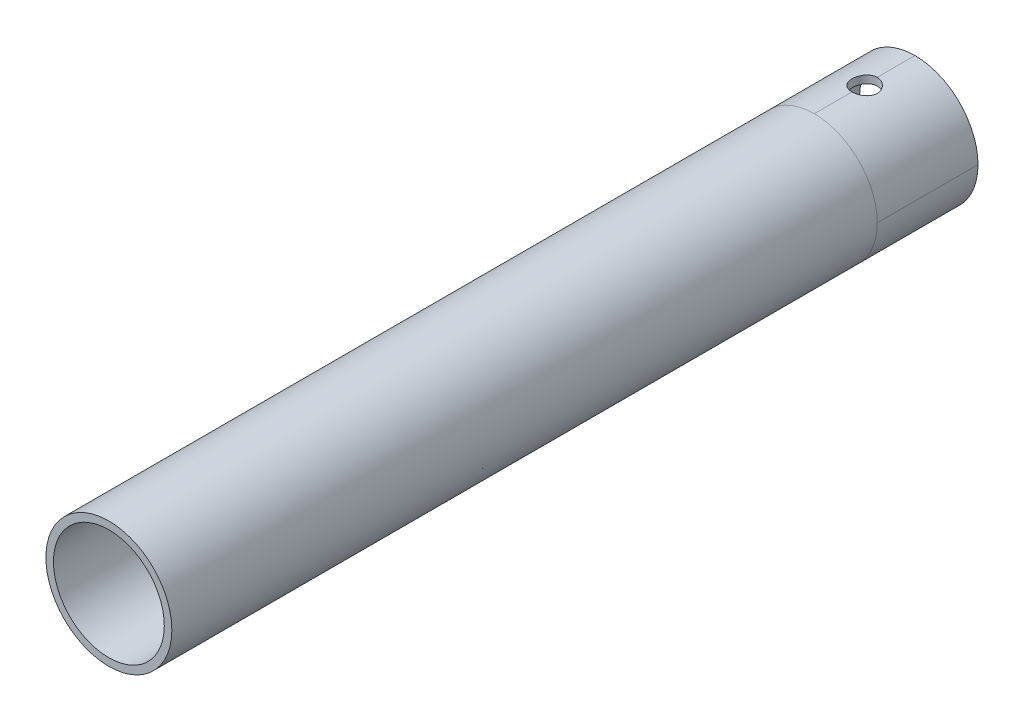
ISO-10303-21;
HEADER;
FILE_DESCRIPTION(('STEP AP214'),'2;1');
FILE_NAME('part.step','',(''),(''),'','','');
FILE_SCHEMA(('AUTOMOTIVE_DESIGN { 1 0 10303 214 1 1 1 1 }'));
ENDSEC;
DATA;
#1=APPLICATION_CONTEXT('core data for automotive mechanical design processes');
#2=APPLICATION_PROTOCOL_DEFINITION('international standard','automotive_design',2000,#1);
#3=PRODUCT_CONTEXT('',#1,'mechanical');
#4=PRODUCT('Part','Part','',(#3));
#5=PRODUCT_RELATED_PRODUCT_CATEGORY('part','',(#4));
#6=PRODUCT_DEFINITION_FORMATION('','',#4);
#7=PRODUCT_DEFINITION_CONTEXT('part definition',#1,'design');
#8=PRODUCT_DEFINITION('design','',#6,#7);
#9=PRODUCT_DEFINITION_SHAPE('','',#8);
#10=(LENGTH_UNIT() NAMED_UNIT(*) SI_UNIT(.MILLI.,.METRE.));
#11=(NAMED_UNIT(*) PLANE_ANGLE_UNIT() SI_UNIT($,.RADIAN.));
#12=(NAMED_UNIT(*) SI_UNIT($,.STERADIAN.) SOLID_ANGLE_UNIT());
#13=UNCERTAINTY_MEASURE_WITH_UNIT(LENGTH_MEASURE(1.E-05),#10,'distance_accuracy_value','');
#14=(GEOMETRIC_REPRESENTATION_CONTEXT(3) GLOBAL_UNCERTAINTY_ASSIGNED_CONTEXT((#13)) GLOBAL_UNIT_ASSIGNED_CONTEXT((#10,
#11,#12)) REPRESENTATION_CONTEXT('',''));
#15=CARTESIAN_POINT('',(0.,0.,0.));
#16=DIRECTION('',(0.,0.,1.));
#17=DIRECTION('',(1.,0.,0.));
#18=AXIS2_PLACEMENT_3D('',#15,#16,#17);
#19=CARTESIAN_POINT('',(0.,0.,140.));
#20=DIRECTION('',(0.,0.,1.));
#21=DIRECTION('',(1.,0.,0.));
#22=AXIS2_PLACEMENT_3D('',#19,#20,#21);
#23=PLANE('',#22);
#24=CARTESIAN_POINT('',(0.,0.,140.));
#25=DIRECTION('',(0.,0.,1.));
#26=DIRECTION('',(1.,0.,0.));
#27=AXIS2_PLACEMENT_3D('',#24,#25,#26);
#28=CIRCLE('',#27,12.5);
#29=CARTESIAN_POINT('',(12.5,0.,140.));
#30=VERTEX_POINT('',#29);
#31=EDGE_CURVE('E118',#30,#30,#28,.T.);
#32=ORIENTED_EDGE('',*,*,#31,.T.);
#33=EDGE_LOOP('',(#32));
#34=FACE_BOUND('',#33,.T.);
#35=CARTESIAN_POINT('',(0.,0.,140.));
#36=DIRECTION('',(0.,0.,1.));
#37=DIRECTION('',(1.,0.,0.));
#38=AXIS2_PLACEMENT_3D('',#35,#36,#37);
#39=CIRCLE('',#38,11.);
#40=CARTESIAN_POINT('',(11.,0.,140.));
#41=VERTEX_POINT('',#40);
#42=EDGE_CURVE('E115',#41,#41,#39,.T.);
#43=ORIENTED_EDGE('',*,*,#42,.F.);
#44=EDGE_LOOP('',(#43));
#45=FACE_BOUND('',#44,.T.);
#46=ADVANCED_FACE('F35',(#34,#45),#23,.T.);
#47=CARTESIAN_POINT('',(0.,0.,140.));
#48=DIRECTION('',(0.,0.,-1.));
#49=DIRECTION('',(-1.,0.,0.));
#50=AXIS2_PLACEMENT_3D('',#47,#48,#49);
#51=CYLINDRICAL_SURFACE('',#50,12.5);
#52=ORIENTED_EDGE('',*,*,#31,.F.);
#53=EDGE_LOOP('',(#52));
#54=FACE_BOUND('',#53,.T.);
#55=CARTESIAN_POINT('',(0.,0.,0.));
#56=DIRECTION('',(0.,0.,1.));
#57=DIRECTION('',(1.,0.,0.));
#58=AXIS2_PLACEMENT_3D('',#55,#56,#57);
#59=CIRCLE('',#58,12.5);
#60=CARTESIAN_POINT('',(12.5,0.,0.));
#61=VERTEX_POINT('',#60);
#62=CARTESIAN_POINT('',(0.,12.5,0.));
#63=VERTEX_POINT('',#62);
#64=EDGE_CURVE('E98',#61,#63,#59,.T.);
#65=ORIENTED_EDGE('',*,*,#64,.T.);
#66=CARTESIAN_POINT('',(-12.5,0.,0.));
#67=VERTEX_POINT('',#66);
#68=EDGE_CURVE('E90',#63,#67,#59,.T.);
#69=ORIENTED_EDGE('',*,*,#68,.T.);
#70=CARTESIAN_POINT('',(0.,-12.5,0.));
#71=VERTEX_POINT('',#70);
#72=EDGE_CURVE('E95',#67,#71,#59,.T.);
#73=ORIENTED_EDGE('',*,*,#72,.T.);
#74=EDGE_CURVE('E114',#71,#61,#59,.T.);
#75=ORIENTED_EDGE('',*,*,#74,.T.);
#76=EDGE_LOOP('',(#65,#69,#73,#75));
#77=FACE_BOUND('',#76,.T.);
#78=ADVANCED_FACE('F92',(#54,#77),#51,.T.);
#79=CARTESIAN_POINT('',(0.,0.,140.));
#80=DIRECTION('',(0.,0.,-1.));
#81=DIRECTION('',(-1.,0.,0.));
#82=AXIS2_PLACEMENT_3D('',#79,#80,#81);
#83=CYLINDRICAL_SURFACE('',#82,11.);
#84=CARTESIAN_POINT('',(0.,11.,-12.5));
#85=CARTESIAN_POINT('',(0.138518278596903,10.9999974735185,-12.4999954681736));
#86=CARTESIAN_POINT('',(0.277090172258006,10.9973570934613,-12.4884487724231));
#87=CARTESIAN_POINT('',(0.550288594599322,10.987079320306,-12.4426205239383));
#88=CARTESIAN_POINT('',(0.684912392220729,10.9794385496265,-12.4083236040447));
#89=CARTESIAN_POINT('',(0.946227671984914,10.9600095312294,-12.3181319513681));
#90=CARTESIAN_POINT('',(1.07292759495647,10.9482257885674,-12.2622606720193));
#91=CARTESIAN_POINT('',(1.31515227582566,10.921778201627,-12.1305828866191));
#92=CARTESIAN_POINT('',(1.43067714503182,10.9071143860398,-12.0547765791576));
#93=CARTESIAN_POINT('',(1.64926760444638,10.8762265816814,-11.8839979553933));
#94=CARTESIAN_POINT('',(1.75211293892049,10.8599819758326,-11.788747426525));
#95=CARTESIAN_POINT('',(1.9405138981661,10.827906511833,-11.5823810258628));
#96=CARTESIAN_POINT('',(2.02606788121784,10.8120756930933,-11.4712636493056));
#97=CARTESIAN_POINT('',(2.17844599401787,10.7824158369221,-11.2346679447163));
#98=CARTESIAN_POINT('',(2.24503254356575,10.7686131580577,-11.1090330036942));
#99=CARTESIAN_POINT('',(2.35606069717869,10.7448696147509,-10.8479904994184));
#100=CARTESIAN_POINT('',(2.40050517717749,10.7349282488168,-10.7125842079384));
#101=CARTESIAN_POINT('',(2.46525349412718,10.7202434469831,-10.4382408128835));
#102=CARTESIAN_POINT('',(2.48594892680754,10.715415797339,-10.2994007368775));
#103=CARTESIAN_POINT('',(2.50382988451487,10.7112523406768,-10.0201417727869));
#104=CARTESIAN_POINT('',(2.50101853886552,10.711915802658,-9.87972309733773));
#105=CARTESIAN_POINT('',(2.47228016958762,10.7185835035919,-9.60422711665131));
#106=CARTESIAN_POINT('',(2.44681104599437,10.7244819412976,-9.46909909380509));
#107=CARTESIAN_POINT('',(2.37420684920502,10.7407873672743,-9.20508551384518));
#108=CARTESIAN_POINT('',(2.32707047404288,10.7511946264744,-9.07620033237282));
#109=CARTESIAN_POINT('',(2.21205734402544,10.7754474384537,-8.82705932818947));
#110=CARTESIAN_POINT('',(2.14400712086008,10.7893215597825,-8.70688648223632));
#111=CARTESIAN_POINT('',(1.98921977920408,10.8189276843241,-8.47949744688894));
#112=CARTESIAN_POINT('',(1.90247992237134,10.8346599596346,-8.37228315973607));
#113=CARTESIAN_POINT('',(1.71036518003516,10.8666615287251,-8.17122143817898));
#114=CARTESIAN_POINT('',(1.60460166742827,10.882934773515,-8.07774557348365));
#115=CARTESIAN_POINT('',(1.37871229840972,10.9138502597158,-7.90979411129289));
#116=CARTESIAN_POINT('',(1.2585861400908,10.9284924668293,-7.83531891330053));
#117=CARTESIAN_POINT('',(1.00690799179915,10.9545497424637,-7.7073796120285));
#118=CARTESIAN_POINT('',(0.875328834348158,10.9659568484873,-7.65396722637767));
#119=CARTESIAN_POINT('',(0.604745122491698,10.9841998956698,-7.57011599413208));
#120=CARTESIAN_POINT('',(0.465741739663721,10.9910365557784,-7.53967353417782));
#121=CARTESIAN_POINT('',(0.187439840192733,10.9992650071756,-7.50317376252731));
#122=CARTESIAN_POINT('',(0.0482110923370386,11.0007700184113,-7.49660930868327));
#123=CARTESIAN_POINT('',(-0.229353886680103,10.9984842255063,-7.50667303985293));
#124=CARTESIAN_POINT('',(-0.367690182720858,10.9946938107912,-7.52329951940597));
#125=CARTESIAN_POINT('',(-0.637841677218459,10.9823148103741,-7.57885316690542));
#126=CARTESIAN_POINT('',(-0.769715036814426,10.973784087055,-7.61751154644373));
#127=CARTESIAN_POINT('',(-1.0251039308776,10.9528806132367,-7.71573102745708));
#128=CARTESIAN_POINT('',(-1.14861871432289,10.9405075180554,-7.77529400425327));
#129=CARTESIAN_POINT('',(-1.38586085256056,10.9130143275095,-7.91466914355534));
#130=CARTESIAN_POINT('',(-1.49941068522719,10.8978552985532,-7.99477562677316));
#131=CARTESIAN_POINT('',(-1.71163773579052,10.866546095646,-8.17257932844021));
#132=CARTESIAN_POINT('',(-1.8103128535797,10.8503957821912,-8.27027902654685));
#133=CARTESIAN_POINT('',(-1.99201706218096,10.8185287714487,-8.48283096513342));
#134=CARTESIAN_POINT('',(-2.07469366594062,10.8028272119253,-8.59798724178681));
#135=CARTESIAN_POINT('',(-2.21953814406553,10.7740023321604,-8.84084639067028));
#136=CARTESIAN_POINT('',(-2.28170692501017,10.7608788979592,-8.96854870795962));
#137=CARTESIAN_POINT('',(-2.38333597241928,10.7388274870674,-9.23218046956891));
#138=CARTESIAN_POINT('',(-2.42292716221705,10.7298753781702,-9.36805732374335));
#139=CARTESIAN_POINT('',(-2.47865258340365,10.7171411058581,-9.64476690669913));
#140=CARTESIAN_POINT('',(-2.49479091341614,10.7133580391079,-9.7855987651364));
#141=CARTESIAN_POINT('',(-2.50296739214165,10.7114502943222,-10.0646586193109));
#142=CARTESIAN_POINT('',(-2.49556548501071,10.7131941458177,-10.2028695993336));
#143=CARTESIAN_POINT('',(-2.45813115403283,10.7218446846914,-10.4760189101883));
#144=CARTESIAN_POINT('',(-2.42809904217009,10.7287513008948,-10.6109572861105));
#145=CARTESIAN_POINT('',(-2.34653692360609,10.7468826027048,-10.8732433973663));
#146=CARTESIAN_POINT('',(-2.29509457527995,10.758089666867,-11.0006196911415));
#147=CARTESIAN_POINT('',(-2.1722453660688,10.783564723281,-11.2450147069006));
#148=CARTESIAN_POINT('',(-2.10083623731223,10.7978330631966,-11.3620322503255));
#149=CARTESIAN_POINT('',(-1.93824996891049,10.828211072634,-11.5851344276553));
#150=CARTESIAN_POINT('',(-1.84667645642834,10.8443540558786,-11.6909257222074));
#151=CARTESIAN_POINT('',(-1.64715628932418,10.8764454859305,-11.885823185082));
#152=CARTESIAN_POINT('',(-1.53920583540676,10.8923938866665,-11.974925470966));
#153=CARTESIAN_POINT('',(-1.30814060515057,10.9225693389041,-12.1351380602337));
#154=CARTESIAN_POINT('',(-1.1848316218762,10.9367686161711,-12.2059738233331));
#155=CARTESIAN_POINT('',(-0.927755967711692,10.9615640551399,-12.325799970663));
#156=CARTESIAN_POINT('',(-0.793997844337698,10.9721631246672,-12.3748079947867));
#157=CARTESIAN_POINT('',(-0.550163071539624,10.9867559512784,-12.4412279061761));
#158=CARTESIAN_POINT('',(-0.441368111138491,10.9916908558499,-12.4632239876893));
#159=CARTESIAN_POINT('',(-0.221726814930918,10.9983138080738,-12.4926114735793));
#160=CARTESIAN_POINT('',(-0.110880584717102,11.0000020223883,-12.5000036276192));
#161=CARTESIAN_POINT('',(0.,11.,-12.5));
#162=B_SPLINE_CURVE_WITH_KNOTS('',3,(#84,#85,#86,#87,#88,#89,#90,#91,#92,#93,#94,#95,#96,#97,
#98,#99,#100,#101,#102,#103,#104,#105,#106,#107,#108,#109,#110,#111,#112,#113,#114,#115,#116,
#117,#118,#119,#120,#121,#122,#123,#124,#125,#126,#127,#128,#129,#130,#131,#132,#133,#134,#135,
#136,#137,#138,#139,#140,#141,#142,#143,#144,#145,#146,#147,#148,#149,#150,#151,#152,#153,#154,
#155,#156,#157,#158,#159,#160,#161),.UNSPECIFIED.,.T.,.F.,(4,2,2,2,2,2,2,2,2,2,2,2,2,2,2,2,2,2,
2,2,2,2,2,2,2,2,2,2,2,2,2,2,2,2,2,2,2,2,4),(0.,0.415148849633315,0.830578406996928,
1.24555761755318,1.66053269430525,2.08192389396809,2.50335508365802,2.92985362973414,
3.35629676538239,3.77560244898081,4.19485231368757,4.60581714174235,5.01680666753971,
5.4313015743885,5.84585725297978,6.27011531803704,6.69438230269862,7.11968464096647,
7.54492006169895,7.96106941916761,8.37718817463627,8.78833576149036,9.19952024123083,
9.61696129328767,10.0344612272567,10.4603132154039,10.8861463755948,11.3094844190899,
11.732748471094,12.1460204395145,12.5592867105953,12.9708773657615,13.382514789318,
13.8031102578591,14.2238034502007,14.6504927745347,15.0768366452215,15.4091704772436,
15.74148724914),.UNSPECIFIED.);
#163=CARTESIAN_POINT('',(0.,11.,-12.5));
#164=VERTEX_POINT('',#163);
#165=EDGE_CURVE('E151',#164,#164,#162,.T.);
#166=ORIENTED_EDGE('',*,*,#165,.F.);
#167=EDGE_LOOP('',(#166));
#168=FACE_BOUND('',#167,.T.);
#169=CARTESIAN_POINT('',(0.,-11.,-12.5));
#170=CARTESIAN_POINT('',(-0.138518278596905,-10.9999974735185,-12.4999954681736));
#171=CARTESIAN_POINT('',(-0.277090172258009,-10.9973570934613,-12.4884487724231));
#172=CARTESIAN_POINT('',(-0.550288594599324,-10.987079320306,-12.4426205239383));
#173=CARTESIAN_POINT('',(-0.684912392220731,-10.9794385496265,-12.4083236040447));
#174=CARTESIAN_POINT('',(-0.946227671984917,-10.9600095312294,-12.3181319513681));
#175=CARTESIAN_POINT('',(-1.07292759495647,-10.9482257885674,-12.2622606720193));
#176=CARTESIAN_POINT('',(-1.31515227582566,-10.921778201627,-12.1305828866191));
#177=CARTESIAN_POINT('',(-1.43067714503182,-10.9071143860398,-12.0547765791576));
#178=CARTESIAN_POINT('',(-1.64926760444638,-10.8762265816814,-11.8839979553933));
#179=CARTESIAN_POINT('',(-1.75211293892049,-10.8599819758326,-11.788747426525));
#180=CARTESIAN_POINT('',(-1.94051389816611,-10.827906511833,-11.5823810258628));
#181=CARTESIAN_POINT('',(-2.02606788121784,-10.8120756930933,-11.4712636493056));
#182=CARTESIAN_POINT('',(-2.17844599401787,-10.7824158369221,-11.2346679447163));
#183=CARTESIAN_POINT('',(-2.24503254356575,-10.7686131580577,-11.1090330036942));
#184=CARTESIAN_POINT('',(-2.3560606971787,-10.7448696147509,-10.8479904994184));
#185=CARTESIAN_POINT('',(-2.40050517717749,-10.7349282488168,-10.7125842079384));
#186=CARTESIAN_POINT('',(-2.46525349412718,-10.7202434469831,-10.4382408128835));
#187=CARTESIAN_POINT('',(-2.48594892680754,-10.715415797339,-10.2994007368775));
#188=CARTESIAN_POINT('',(-2.50382988451487,-10.7112523406768,-10.0201417727869));
#189=CARTESIAN_POINT('',(-2.50101853886553,-10.711915802658,-9.87972309733773));
#190=CARTESIAN_POINT('',(-2.47228016958762,-10.7185835035919,-9.60422711665131));
#191=CARTESIAN_POINT('',(-2.44681104599438,-10.7244819412976,-9.46909909380509));
#192=CARTESIAN_POINT('',(-2.37420684920502,-10.7407873672743,-9.20508551384518));
#193=CARTESIAN_POINT('',(-2.32707047404288,-10.7511946264744,-9.07620033237282));
#194=CARTESIAN_POINT('',(-2.21205734402544,-10.7754474384537,-8.82705932818947));
#195=CARTESIAN_POINT('',(-2.14400712086008,-10.7893215597825,-8.70688648223631));
#196=CARTESIAN_POINT('',(-1.98921977920408,-10.8189276843241,-8.47949744688894));
#197=CARTESIAN_POINT('',(-1.90247992237134,-10.8346599596346,-8.37228315973607));
#198=CARTESIAN_POINT('',(-1.71036518003516,-10.8666615287251,-8.17122143817898));
#199=CARTESIAN_POINT('',(-1.60460166742827,-10.882934773515,-8.07774557348365));
#200=CARTESIAN_POINT('',(-1.37871229840972,-10.9138502597158,-7.90979411129289));
#201=CARTESIAN_POINT('',(-1.2585861400908,-10.9284924668293,-7.83531891330053));
#202=CARTESIAN_POINT('',(-1.00690799179916,-10.9545497424637,-7.7073796120285));
#203=CARTESIAN_POINT('',(-0.875328834348159,-10.9659568484873,-7.65396722637767));
#204=CARTESIAN_POINT('',(-0.604745122491699,-10.9841998956698,-7.57011599413208));
#205=CARTESIAN_POINT('',(-0.465741739663722,-10.9910365557784,-7.53967353417782));
#206=CARTESIAN_POINT('',(-0.187439840192734,-10.9992650071756,-7.50317376252731));
#207=CARTESIAN_POINT('',(-0.0482110923370392,-11.0007700184113,-7.49660930868327));
#208=CARTESIAN_POINT('',(0.229353886680103,-10.9984842255063,-7.50667303985293));
#209=CARTESIAN_POINT('',(0.367690182720857,-10.9946938107912,-7.52329951940597));
#210=CARTESIAN_POINT('',(0.637841677218458,-10.9823148103741,-7.57885316690542));
#211=CARTESIAN_POINT('',(0.769715036814426,-10.973784087055,-7.61751154644374));
#212=CARTESIAN_POINT('',(1.0251039308776,-10.9528806132367,-7.71573102745708));
#213=CARTESIAN_POINT('',(1.14861871432289,-10.9405075180554,-7.77529400425327));
#214=CARTESIAN_POINT('',(1.38586085256056,-10.9130143275095,-7.91466914355534));
#215=CARTESIAN_POINT('',(1.49941068522719,-10.8978552985532,-7.99477562677316));
#216=CARTESIAN_POINT('',(1.71163773579052,-10.866546095646,-8.17257932844021));
#217=CARTESIAN_POINT('',(1.8103128535797,-10.8503957821912,-8.27027902654685));
#218=CARTESIAN_POINT('',(1.99201706218096,-10.8185287714487,-8.48283096513343));
#219=CARTESIAN_POINT('',(2.07469366594062,-10.8028272119253,-8.59798724178681));
#220=CARTESIAN_POINT('',(2.21953814406552,-10.7740023321604,-8.84084639067028));
#221=CARTESIAN_POINT('',(2.28170692501017,-10.7608788979592,-8.96854870795963));
#222=CARTESIAN_POINT('',(2.38333597241927,-10.7388274870674,-9.23218046956892));
#223=CARTESIAN_POINT('',(2.42292716221704,-10.7298753781702,-9.36805732374335));
#224=CARTESIAN_POINT('',(2.47865258340364,-10.7171411058581,-9.64476690669913));
#225=CARTESIAN_POINT('',(2.49479091341614,-10.7133580391079,-9.7855987651364));
#226=CARTESIAN_POINT('',(2.50296739214164,-10.7114502943222,-10.0646586193109));
#227=CARTESIAN_POINT('',(2.4955654850107,-10.7131941458177,-10.2028695993336));
#228=CARTESIAN_POINT('',(2.45813115403283,-10.7218446846914,-10.4760189101883));
#229=CARTESIAN_POINT('',(2.42809904217009,-10.7287513008948,-10.6109572861105));
#230=CARTESIAN_POINT('',(2.34653692360609,-10.7468826027048,-10.8732433973663));
#231=CARTESIAN_POINT('',(2.29509457527995,-10.758089666867,-11.0006196911415));
#232=CARTESIAN_POINT('',(2.1722453660688,-10.783564723281,-11.2450147069006));
#233=CARTESIAN_POINT('',(2.10083623731223,-10.7978330631966,-11.3620322503255));
#234=CARTESIAN_POINT('',(1.93824996891049,-10.828211072634,-11.5851344276553));
#235=CARTESIAN_POINT('',(1.84667645642834,-10.8443540558786,-11.6909257222074));
#236=CARTESIAN_POINT('',(1.64715628932417,-10.8764454859305,-11.885823185082));
#237=CARTESIAN_POINT('',(1.53920583540675,-10.8923938866665,-11.974925470966));
#238=CARTESIAN_POINT('',(1.30814060515056,-10.9225693389041,-12.1351380602337));
#239=CARTESIAN_POINT('',(1.18483162187619,-10.9367686161711,-12.2059738233331));
#240=CARTESIAN_POINT('',(0.927755967711685,-10.9615640551399,-12.325799970663));
#241=CARTESIAN_POINT('',(0.793997844337692,-10.9721631246672,-12.3748079947867));
#242=CARTESIAN_POINT('',(0.550163071539618,-10.9867559512784,-12.4412279061761));
#243=CARTESIAN_POINT('',(0.441368111138485,-10.9916908558499,-12.4632239876893));
#244=CARTESIAN_POINT('',(0.221726814930914,-10.9983138080738,-12.4926114735793));
#245=CARTESIAN_POINT('',(0.110880584717099,-11.0000020223883,-12.5000036276192));
#246=CARTESIAN_POINT('',(0.,-11.,-12.5));
#247=B_SPLINE_CURVE_WITH_KNOTS('',3,(#169,#170,#171,#172,#173,#174,#175,#176,#177,#178,#179,
#180,#181,#182,#183,#184,#185,#186,#187,#188,#189,#190,#191,#192,#193,#194,#195,#196,#197,#198,
#199,#200,#201,#202,#203,#204,#205,#206,#207,#208,#209,#210,#211,#212,#213,#214,#215,#216,#217,
#218,#219,#220,#221,#222,#223,#224,#225,#226,#227,#228,#229,#230,#231,#232,#233,#234,#235,#236,
#237,#238,#239,#240,#241,#242,#243,#244,#245,#246),.UNSPECIFIED.,.T.,.F.,(4,2,2,2,2,2,2,2,2,2,2,
2,2,2,2,2,2,2,2,2,2,2,2,2,2,2,2,2,2,2,2,2,2,2,2,2,2,2,4),(0.,0.415148849633315,
0.830578406996929,1.24555761755319,1.66053269430525,2.08192389396809,2.50335508365802,
2.92985362973414,3.35629676538239,3.77560244898082,4.19485231368758,4.60581714174235,
5.01680666753971,5.4313015743885,5.84585725297978,6.27011531803704,6.69438230269863,
7.11968464096647,7.54492006169895,7.96106941916762,8.37718817463627,8.78833576149036,
9.19952024123083,9.61696129328767,10.0344612272567,10.460313215404,10.8861463755948,
11.3094844190899,11.732748471094,12.1460204395145,12.5592867105953,12.9708773657615,
13.382514789318,13.8031102578591,14.2238034502007,14.6504927745347,15.0768366452215,
15.4091704772436,15.74148724914),.UNSPECIFIED.);
#248=CARTESIAN_POINT('',(0.,-11.,-12.5));
#249=VERTEX_POINT('',#248);
#250=EDGE_CURVE('E145',#249,#249,#247,.T.);
#251=ORIENTED_EDGE('',*,*,#250,.F.);
#252=EDGE_LOOP('',(#251));
#253=FACE_BOUND('',#252,.T.);
#254=ORIENTED_EDGE('',*,*,#42,.T.);
#255=EDGE_LOOP('',(#254));
#256=FACE_BOUND('',#255,.T.);
#257=CARTESIAN_POINT('',(0.,0.,-20.));
#258=DIRECTION('',(0.,0.,-1.));
#259=DIRECTION('',(-1.,0.,0.));
#260=AXIS2_PLACEMENT_3D('',#257,#258,#259);
#261=CIRCLE('',#260,11.);
#262=CARTESIAN_POINT('',(-11.,0.,-20.));
#263=VERTEX_POINT('',#262);
#264=EDGE_CURVE('E209',#263,#263,#261,.F.);
#265=ORIENTED_EDGE('',*,*,#264,.F.);
#266=EDGE_LOOP('',(#265));
#267=FACE_BOUND('',#266,.T.);
#268=ADVANCED_FACE('F182',(#168,#253,#256,#267),#83,.F.);
#269=CARTESIAN_POINT('',(0.,0.,-20.));
#270=DIRECTION('',(0.,0.,-1.));
#271=DIRECTION('',(-1.,0.,0.));
#272=AXIS2_PLACEMENT_3D('',#269,#270,#271);
#273=PLANE('',#272);
#274=CARTESIAN_POINT('',(0.,0.,-20.));
#275=DIRECTION('',(0.,0.,-1.));
#276=DIRECTION('',(-1.,0.,0.));
#277=AXIS2_PLACEMENT_3D('',#274,#275,#276);
#278=CIRCLE('',#277,12.5);
#279=CARTESIAN_POINT('',(0.,12.5,-20.));
#280=VERTEX_POINT('',#279);
#281=CARTESIAN_POINT('',(12.5,0.,-20.));
#282=VERTEX_POINT('',#281);
#283=EDGE_CURVE('E200',#280,#282,#278,.T.);
#284=ORIENTED_EDGE('',*,*,#283,.T.);
#285=CARTESIAN_POINT('',(0.,0.,-20.));
#286=DIRECTION('',(0.,0.,-1.));
#287=DIRECTION('',(-1.,0.,0.));
#288=AXIS2_PLACEMENT_3D('',#285,#286,#287);
#289=CIRCLE('',#288,12.5);
#290=CARTESIAN_POINT('',(0.,-12.5,-20.));
#291=VERTEX_POINT('',#290);
#292=EDGE_CURVE('E161',#282,#291,#289,.T.);
#293=ORIENTED_EDGE('',*,*,#292,.T.);
#294=CARTESIAN_POINT('',(0.,0.,-20.));
#295=DIRECTION('',(0.,0.,-1.));
#296=DIRECTION('',(-1.,0.,0.));
#297=AXIS2_PLACEMENT_3D('',#294,#295,#296);
#298=CIRCLE('',#297,12.5);
#299=CARTESIAN_POINT('',(-12.5,0.,-20.));
#300=VERTEX_POINT('',#299);
#301=EDGE_CURVE('E201',#291,#300,#298,.T.);
#302=ORIENTED_EDGE('',*,*,#301,.T.);
#303=CARTESIAN_POINT('',(0.,0.,-20.));
#304=DIRECTION('',(0.,0.,-1.));
#305=DIRECTION('',(-1.,0.,0.));
#306=AXIS2_PLACEMENT_3D('',#303,#304,#305);
#307=CIRCLE('',#306,12.5);
#308=EDGE_CURVE('E105',#300,#280,#307,.T.);
#309=ORIENTED_EDGE('',*,*,#308,.T.);
#310=EDGE_LOOP('',(#284,#293,#302,#309));
#311=FACE_BOUND('',#310,.T.);
#312=ORIENTED_EDGE('',*,*,#264,.T.);
#313=EDGE_LOOP('',(#312));
#314=FACE_BOUND('',#313,.T.);
#315=ADVANCED_FACE('F139',(#311,#314),#273,.T.);
#316=CARTESIAN_POINT('',(0.,27.5,-10.));
#317=DIRECTION('',(0.,-1.,0.));
#318=DIRECTION('',(0.,0.,-1.));
#319=AXIS2_PLACEMENT_3D('',#316,#317,#318);
#320=CYLINDRICAL_SURFACE('',#319,2.5);
#321=ORIENTED_EDGE('',*,*,#250,.T.);
#322=EDGE_LOOP('',(#321));
#323=FACE_BOUND('',#322,.T.);
#324=CARTESIAN_POINT('',(0.,-12.5,-7.5));
#325=CARTESIAN_POINT('',(-0.0695781037013801,-12.5000055691702,-7.49999248083964));
#326=CARTESIAN_POINT('',(-0.139152113651009,-12.499419188421,-7.50290458457511));
#327=CARTESIAN_POINT('',(-0.277789170105315,-12.497103769276,-7.514509744488));
#328=CARTESIAN_POINT('',(-0.346852276173052,-12.4953748662721,-7.52320211568845));
#329=CARTESIAN_POINT('',(-0.483879393643665,-12.4908190204693,-7.5462923419301));
#330=CARTESIAN_POINT('',(-0.551844888273851,-12.4879937162335,-7.5606816835385));
#331=CARTESIAN_POINT('',(-0.686280644932569,-12.4813283643556,-7.5950386833208));
#332=CARTESIAN_POINT('',(-0.752750902776739,-12.4774883138739,-7.61500635710333));
#333=CARTESIAN_POINT('',(-0.949237994536963,-12.4645938225901,-7.68308015982211));
#334=CARTESIAN_POINT('',(-1.07643631854857,-12.4541613083796,-7.73937492926214));
#335=CARTESIAN_POINT('',(-1.31952361958077,-12.4307613572158,-7.87207451483428));
#336=CARTESIAN_POINT('',(-1.43541159011704,-12.417793694973,-7.94848111844315));
#337=CARTESIAN_POINT('',(-1.65422316246035,-12.3905548780014,-8.12034099913268));
#338=CARTESIAN_POINT('',(-1.75697429492782,-12.3762699355359,-8.21601206223506));
#339=CARTESIAN_POINT('',(-1.94508588038253,-12.3481056979896,-8.42322158753791));
#340=CARTESIAN_POINT('',(-2.03044344391941,-12.3342264706343,-8.53476268087781));
#341=CARTESIAN_POINT('',(-2.18208108228169,-12.3083106950016,-8.77179367925153));
#342=CARTESIAN_POINT('',(-2.24818089578944,-12.2962920225725,-8.89740104350523));
#343=CARTESIAN_POINT('',(-2.35826671661896,-12.2756562198657,-9.15821206194541));
#344=CARTESIAN_POINT('',(-2.40225612807952,-12.2670385660078,-9.29341423524573));
#345=CARTESIAN_POINT('',(-2.46631284614522,-12.2543202064808,-9.56770930120907));
#346=CARTESIAN_POINT('',(-2.48668576132239,-12.2501618495002,-9.70672809585308));
#347=CARTESIAN_POINT('',(-2.50388039948337,-12.2466593618523,-9.98627126048349));
#348=CARTESIAN_POINT('',(-2.50070398034014,-12.2473148514071,-10.1267955108268));
#349=CARTESIAN_POINT('',(-2.47113637976745,-12.2533137895302,-10.4031174731333));
#350=CARTESIAN_POINT('',(-2.44509616848213,-12.2585863604449,-10.5389545087181));
#351=CARTESIAN_POINT('',(-2.37109435205471,-12.2731137212811,-10.8042911390024));
#352=CARTESIAN_POINT('',(-2.32313185988532,-12.2823686723383,-10.9337904770287));
#353=CARTESIAN_POINT('',(-2.20631104875647,-12.3038906375592,-11.1837901788259));
#354=CARTESIAN_POINT('',(-2.13731328401866,-12.3161776447723,-11.3042235889813));
#355=CARTESIAN_POINT('',(-1.98048094880143,-12.342365918702,-11.5319306128859));
#356=CARTESIAN_POINT('',(-1.89264482136082,-12.356267318802,-11.6392031377559));
#357=CARTESIAN_POINT('',(-1.69876298731572,-12.3844237032604,-11.8395604389324));
#358=CARTESIAN_POINT('',(-1.5924198656712,-12.3986805663766,-11.9323573533271));
#359=CARTESIAN_POINT('',(-1.36549178176277,-12.4257178890174,-12.0988656229153));
#360=CARTESIAN_POINT('',(-1.24490297412952,-12.4384979480549,-12.1725718076868));
#361=CARTESIAN_POINT('',(-0.992569710917808,-12.4611750627937,-12.2988615331366));
#362=CARTESIAN_POINT('',(-0.860802245133961,-12.4710659760705,-12.3514001594511));
#363=CARTESIAN_POINT('',(-0.590154673155504,-12.4867929923002,-12.4334430123794));
#364=CARTESIAN_POINT('',(-0.451285403866764,-12.4926350862824,-12.4629812806107));
#365=CARTESIAN_POINT('',(-0.259422160741022,-12.4974157216073,-12.4870509266254));
#366=CARTESIAN_POINT('',(-0.207615921267005,-12.4983838721018,-12.4919085424005));
#367=CARTESIAN_POINT('',(-0.103880902221563,-12.499675447889,-12.4983790005422));
#368=CARTESIAN_POINT('',(-0.051952476887023,-12.4999999582349,-12.4999973038072));
#369=CARTESIAN_POINT('',(0.,-12.5,-12.5));
#370=B_SPLINE_CURVE_WITH_KNOTS('',3,(#324,#325,#326,#327,#328,#329,#330,#331,#332,#333,#334,
#335,#336,#337,#338,#339,#340,#341,#342,#343,#344,#345,#346,#347,#348,#349,#350,#351,#352,#353,
#354,#355,#356,#357,#358,#359,#360,#361,#362,#363,#364,#365,#366,#367,#368,#369),.UNSPECIFIED.,
.F.,.F.,(4,2,2,2,2,2,2,2,2,2,2,2,2,2,2,2,2,2,2,2,2,2,4),(0.,0.208663758714022,0.417302794626235,
0.625631214508547,0.833960217317408,1.25030202456207,1.66668084746238,2.08806174373864,
2.5095125835887,2.93479020311904,3.36000232642616,3.77964831619589,4.19926119927029,
4.612543274471,5.02584207352143,5.44194256546428,5.85807746072289,6.28165032064538,
6.70533777890381,7.12991956239267,7.55387174398069,7.70991829582185,7.86570155893096),.UNSPECIFIED.);
#371=CARTESIAN_POINT('',(0.,-12.5,-7.5));
#372=VERTEX_POINT('',#371);
#373=CARTESIAN_POINT('',(0.,-12.5,-12.5));
#374=VERTEX_POINT('',#373);
#375=EDGE_CURVE('E120',#372,#374,#370,.T.);
#376=ORIENTED_EDGE('',*,*,#375,.T.);
#377=CARTESIAN_POINT('',(0.,-12.5,-12.5));
#378=CARTESIAN_POINT('',(0.0695781037013802,-12.5000055691702,-12.5000075191604));
#379=CARTESIAN_POINT('',(0.13915211365101,-12.499419188421,-12.4970954154249));
#380=CARTESIAN_POINT('',(0.277789170105316,-12.497103769276,-12.485490255512));
#381=CARTESIAN_POINT('',(0.346852276173053,-12.4953748662721,-12.4767978843116));
#382=CARTESIAN_POINT('',(0.483879393643665,-12.4908190204693,-12.4537076580699));
#383=CARTESIAN_POINT('',(0.551844888273851,-12.4879937162335,-12.4393183164615));
#384=CARTESIAN_POINT('',(0.68628064493257,-12.4813283643556,-12.4049613166792));
#385=CARTESIAN_POINT('',(0.75275090277674,-12.4774883138739,-12.3849936428967));
#386=CARTESIAN_POINT('',(0.949237994536963,-12.4645938225901,-12.3169198401779));
#387=CARTESIAN_POINT('',(1.07643631854857,-12.4541613083796,-12.2606250707379));
#388=CARTESIAN_POINT('',(1.31952361958077,-12.4307613572158,-12.1279254851657));
#389=CARTESIAN_POINT('',(1.43541159011704,-12.417793694973,-12.0515188815569));
#390=CARTESIAN_POINT('',(1.65422316246035,-12.3905548780014,-11.8796590008673));
#391=CARTESIAN_POINT('',(1.75697429492782,-12.3762699355359,-11.7839879377649));
#392=CARTESIAN_POINT('',(1.94508588038253,-12.3481056979896,-11.5767784124621));
#393=CARTESIAN_POINT('',(2.03044344391941,-12.3342264706343,-11.4652373191222));
#394=CARTESIAN_POINT('',(2.18208108228169,-12.3083106950016,-11.2282063207485));
#395=CARTESIAN_POINT('',(2.24818089578943,-12.2962920225725,-11.1025989564948));
#396=CARTESIAN_POINT('',(2.35826671661895,-12.2756562198657,-10.8417879380546));
#397=CARTESIAN_POINT('',(2.40225612807952,-12.2670385660078,-10.7065857647543));
#398=CARTESIAN_POINT('',(2.46631284614522,-12.2543202064808,-10.4322906987909));
#399=CARTESIAN_POINT('',(2.48668576132238,-12.2501618495002,-10.2932719041469));
#400=CARTESIAN_POINT('',(2.50388039948337,-12.2466593618523,-10.0137287395165));
#401=CARTESIAN_POINT('',(2.50070398034014,-12.2473148514071,-9.87320448917315));
#402=CARTESIAN_POINT('',(2.47113637976745,-12.2533137895302,-9.59688252686674));
#403=CARTESIAN_POINT('',(2.44509616848213,-12.2585863604449,-9.46104549128187));
#404=CARTESIAN_POINT('',(2.3710943520547,-12.2731137212811,-9.19570886099765));
#405=CARTESIAN_POINT('',(2.32313185988531,-12.2823686723383,-9.06620952297127));
#406=CARTESIAN_POINT('',(2.20631104875646,-12.3038906375592,-8.81620982117412));
#407=CARTESIAN_POINT('',(2.13731328401866,-12.3161776447723,-8.69577641101871));
#408=CARTESIAN_POINT('',(1.98048094880142,-12.342365918702,-8.46806938711406));
#409=CARTESIAN_POINT('',(1.89264482136081,-12.356267318802,-8.3607968622441));
#410=CARTESIAN_POINT('',(1.69876298731572,-12.3844237032604,-8.16043956106762));
#411=CARTESIAN_POINT('',(1.5924198656712,-12.3986805663766,-8.06764264667293));
#412=CARTESIAN_POINT('',(1.36549178176277,-12.4257178890174,-7.90113437708468));
#413=CARTESIAN_POINT('',(1.24490297412951,-12.4384979480549,-7.82742819231321));
#414=CARTESIAN_POINT('',(0.992569710917801,-12.4611750627937,-7.70113846686336));
#415=CARTESIAN_POINT('',(0.860802245133955,-12.4710659760705,-7.64859984054888));
#416=CARTESIAN_POINT('',(0.590154673155497,-12.4867929923002,-7.56655698762061));
#417=CARTESIAN_POINT('',(0.451285403866756,-12.4926350862824,-7.53701871938933));
#418=CARTESIAN_POINT('',(0.259422160741016,-12.4974157216073,-7.51294907337461));
#419=CARTESIAN_POINT('',(0.207615921266999,-12.4983838721018,-7.50809145759952));
#420=CARTESIAN_POINT('',(0.10388090222156,-12.499675447889,-7.50162099945781));
#421=CARTESIAN_POINT('',(0.0519524768870215,-12.4999999582349,-7.50000269619278));
#422=CARTESIAN_POINT('',(0.,-12.5,-7.5));
#423=B_SPLINE_CURVE_WITH_KNOTS('',3,(#377,#378,#379,#380,#381,#382,#383,#384,#385,#386,#387,
#388,#389,#390,#391,#392,#393,#394,#395,#396,#397,#398,#399,#400,#401,#402,#403,#404,#405,#406,
#407,#408,#409,#410,#411,#412,#413,#414,#415,#416,#417,#418,#419,#420,#421,#422),.UNSPECIFIED.,
.F.,.F.,(4,2,2,2,2,2,2,2,2,2,2,2,2,2,2,2,2,2,2,2,2,2,4),(0.,0.208663758714023,0.417302794626235,
0.625631214508548,0.833960217317409,1.25030202456207,1.66668084746238,2.08806174373864,
2.5095125835887,2.93479020311904,3.36000232642616,3.77964831619589,4.1992611992703,
4.61254327447101,5.02584207352143,5.44194256546429,5.85807746072289,6.28165032064538,
6.70533777890381,7.12991956239267,7.5538717439807,7.70991829582185,7.86570155893095),.UNSPECIFIED.);
#424=EDGE_CURVE('E127',#374,#372,#423,.T.);
#425=ORIENTED_EDGE('',*,*,#424,.T.);
#426=EDGE_LOOP('',(#376,#425));
#427=FACE_BOUND('',#426,.T.);
#428=ADVANCED_FACE('F134',(#323,#427),#320,.F.);
#429=ORIENTED_EDGE('',*,*,#165,.T.);
#430=EDGE_LOOP('',(#429));
#431=FACE_BOUND('',#430,.T.);
#432=CARTESIAN_POINT('',(0.,12.5,-12.5));
#433=CARTESIAN_POINT('',(-0.0695781037013801,12.5000055691702,-12.5000075191604));
#434=CARTESIAN_POINT('',(-0.139152113651009,12.499419188421,-12.4970954154249));
#435=CARTESIAN_POINT('',(-0.277789170105315,12.497103769276,-12.485490255512));
#436=CARTESIAN_POINT('',(-0.346852276173052,12.4953748662721,-12.4767978843116));
#437=CARTESIAN_POINT('',(-0.483879393643665,12.4908190204693,-12.4537076580699));
#438=CARTESIAN_POINT('',(-0.551844888273851,12.4879937162335,-12.4393183164615));
#439=CARTESIAN_POINT('',(-0.686280644932569,12.4813283643556,-12.4049613166792));
#440=CARTESIAN_POINT('',(-0.752750902776739,12.4774883138739,-12.3849936428967));
#441=CARTESIAN_POINT('',(-0.949237994536963,12.4645938225901,-12.3169198401779));
#442=CARTESIAN_POINT('',(-1.07643631854857,12.4541613083796,-12.2606250707379));
#443=CARTESIAN_POINT('',(-1.31952361958077,12.4307613572158,-12.1279254851657));
#444=CARTESIAN_POINT('',(-1.43541159011704,12.417793694973,-12.0515188815569));
#445=CARTESIAN_POINT('',(-1.65422316246035,12.3905548780014,-11.8796590008673));
#446=CARTESIAN_POINT('',(-1.75697429492782,12.3762699355359,-11.7839879377649));
#447=CARTESIAN_POINT('',(-1.94508588038253,12.3481056979896,-11.5767784124621));
#448=CARTESIAN_POINT('',(-2.03044344391941,12.3342264706343,-11.4652373191222));
#449=CARTESIAN_POINT('',(-2.18208108228169,12.3083106950016,-11.2282063207485));
#450=CARTESIAN_POINT('',(-2.24818089578944,12.2962920225725,-11.1025989564948));
#451=CARTESIAN_POINT('',(-2.35826671661896,12.2756562198657,-10.8417879380546));
#452=CARTESIAN_POINT('',(-2.40225612807952,12.2670385660078,-10.7065857647543));
#453=CARTESIAN_POINT('',(-2.46631284614522,12.2543202064808,-10.4322906987909));
#454=CARTESIAN_POINT('',(-2.48668576132239,12.2501618495002,-10.2932719041469));
#455=CARTESIAN_POINT('',(-2.50388039948337,12.2466593618523,-10.0137287395165));
#456=CARTESIAN_POINT('',(-2.50070398034014,12.2473148514071,-9.87320448917316));
#457=CARTESIAN_POINT('',(-2.47113637976745,12.2533137895302,-9.59688252686675));
#458=CARTESIAN_POINT('',(-2.44509616848213,12.2585863604449,-9.46104549128187));
#459=CARTESIAN_POINT('',(-2.37109435205471,12.2731137212811,-9.19570886099765));
#460=CARTESIAN_POINT('',(-2.32313185988532,12.2823686723383,-9.06620952297127));
#461=CARTESIAN_POINT('',(-2.20631104875646,12.3038906375592,-8.81620982117413));
#462=CARTESIAN_POINT('',(-2.13731328401866,12.3161776447723,-8.69577641101871));
#463=CARTESIAN_POINT('',(-1.98048094880143,12.342365918702,-8.46806938711406));
#464=CARTESIAN_POINT('',(-1.89264482136082,12.356267318802,-8.3607968622441));
#465=CARTESIAN_POINT('',(-1.69876298731572,12.3844237032604,-8.16043956106763));
#466=CARTESIAN_POINT('',(-1.5924198656712,12.3986805663766,-8.06764264667294));
#467=CARTESIAN_POINT('',(-1.36549178176277,12.4257178890174,-7.90113437708468));
#468=CARTESIAN_POINT('',(-1.24490297412952,12.4384979480549,-7.82742819231321));
#469=CARTESIAN_POINT('',(-0.992569710917807,12.4611750627937,-7.70113846686336));
#470=CARTESIAN_POINT('',(-0.86080224513396,12.4710659760705,-7.64859984054888));
#471=CARTESIAN_POINT('',(-0.590154673155503,12.4867929923002,-7.56655698762061));
#472=CARTESIAN_POINT('',(-0.451285403866763,12.4926350862824,-7.53701871938933));
#473=CARTESIAN_POINT('',(-0.259422160741021,12.4974157216073,-7.51294907337461));
#474=CARTESIAN_POINT('',(-0.207615921267004,12.4983838721018,-7.50809145759952));
#475=CARTESIAN_POINT('',(-0.103880902221563,12.499675447889,-7.50162099945781));
#476=CARTESIAN_POINT('',(-0.0519524768870228,12.4999999582349,-7.50000269619278));
#477=CARTESIAN_POINT('',(0.,12.5,-7.5));
#478=B_SPLINE_CURVE_WITH_KNOTS('',3,(#432,#433,#434,#435,#436,#437,#438,#439,#440,#441,#442,
#443,#444,#445,#446,#447,#448,#449,#450,#451,#452,#453,#454,#455,#456,#457,#458,#459,#460,#461,
#462,#463,#464,#465,#466,#467,#468,#469,#470,#471,#472,#473,#474,#475,#476,#477),.UNSPECIFIED.,
.F.,.F.,(4,2,2,2,2,2,2,2,2,2,2,2,2,2,2,2,2,2,2,2,2,2,4),(0.,0.208663758714022,0.417302794626235,
0.625631214508547,0.833960217317409,1.25030202456207,1.66668084746238,2.08806174373864,
2.5095125835887,2.93479020311904,3.36000232642616,3.77964831619589,4.19926119927029,
4.612543274471,5.02584207352143,5.44194256546429,5.85807746072289,6.28165032064538,
6.70533777890381,7.12991956239267,7.55387174398069,7.70991829582185,7.86570155893096),.UNSPECIFIED.);
#479=CARTESIAN_POINT('',(0.,12.5,-12.5));
#480=VERTEX_POINT('',#479);
#481=CARTESIAN_POINT('',(0.,12.5,-7.5));
#482=VERTEX_POINT('',#481);
#483=EDGE_CURVE('E45',#480,#482,#478,.T.);
#484=ORIENTED_EDGE('',*,*,#483,.T.);
#485=CARTESIAN_POINT('',(0.,12.5,-7.5));
#486=CARTESIAN_POINT('',(0.0695781037013802,12.5000055691702,-7.49999248083964));
#487=CARTESIAN_POINT('',(0.13915211365101,12.499419188421,-7.50290458457511));
#488=CARTESIAN_POINT('',(0.277789170105315,12.497103769276,-7.514509744488));
#489=CARTESIAN_POINT('',(0.346852276173052,12.4953748662721,-7.52320211568845));
#490=CARTESIAN_POINT('',(0.483879393643665,12.4908190204693,-7.5462923419301));
#491=CARTESIAN_POINT('',(0.551844888273851,12.4879937162335,-7.56068168353851));
#492=CARTESIAN_POINT('',(0.68628064493257,12.4813283643556,-7.5950386833208));
#493=CARTESIAN_POINT('',(0.75275090277674,12.4774883138739,-7.61500635710333));
#494=CARTESIAN_POINT('',(0.949237994536963,12.4645938225901,-7.68308015982211));
#495=CARTESIAN_POINT('',(1.07643631854857,12.4541613083796,-7.73937492926214));
#496=CARTESIAN_POINT('',(1.31952361958077,12.4307613572158,-7.87207451483429));
#497=CARTESIAN_POINT('',(1.43541159011704,12.417793694973,-7.94848111844315));
#498=CARTESIAN_POINT('',(1.65422316246035,12.3905548780014,-8.12034099913268));
#499=CARTESIAN_POINT('',(1.75697429492782,12.3762699355359,-8.21601206223506));
#500=CARTESIAN_POINT('',(1.94508588038253,12.3481056979896,-8.42322158753791));
#501=CARTESIAN_POINT('',(2.03044344391941,12.3342264706343,-8.53476268087781));
#502=CARTESIAN_POINT('',(2.18208108228169,12.3083106950016,-8.77179367925154));
#503=CARTESIAN_POINT('',(2.24818089578943,12.2962920225725,-8.89740104350523));
#504=CARTESIAN_POINT('',(2.35826671661895,12.2756562198657,-9.15821206194541));
#505=CARTESIAN_POINT('',(2.40225612807952,12.2670385660078,-9.29341423524574));
#506=CARTESIAN_POINT('',(2.46631284614522,12.2543202064808,-9.56770930120907));
#507=CARTESIAN_POINT('',(2.48668576132238,12.2501618495002,-9.70672809585309));
#508=CARTESIAN_POINT('',(2.50388039948337,12.2466593618523,-9.9862712604835));
#509=CARTESIAN_POINT('',(2.50070398034014,12.2473148514071,-10.1267955108269));
#510=CARTESIAN_POINT('',(2.47113637976745,12.2533137895302,-10.4031174731333));
#511=CARTESIAN_POINT('',(2.44509616848213,12.2585863604449,-10.5389545087181));
#512=CARTESIAN_POINT('',(2.3710943520547,12.2731137212811,-10.8042911390024));
#513=CARTESIAN_POINT('',(2.32313185988531,12.2823686723383,-10.9337904770287));
#514=CARTESIAN_POINT('',(2.20631104875646,12.3038906375592,-11.1837901788259));
#515=CARTESIAN_POINT('',(2.13731328401866,12.3161776447723,-11.3042235889813));
#516=CARTESIAN_POINT('',(1.98048094880142,12.342365918702,-11.531930612886));
#517=CARTESIAN_POINT('',(1.89264482136081,12.356267318802,-11.6392031377559));
#518=CARTESIAN_POINT('',(1.69876298731572,12.3844237032604,-11.8395604389324));
#519=CARTESIAN_POINT('',(1.5924198656712,12.3986805663766,-11.9323573533271));
#520=CARTESIAN_POINT('',(1.36549178176277,12.4257178890174,-12.0988656229153));
#521=CARTESIAN_POINT('',(1.24490297412951,12.4384979480549,-12.1725718076868));
#522=CARTESIAN_POINT('',(0.9925697109178,12.4611750627937,-12.2988615331366));
#523=CARTESIAN_POINT('',(0.860802245133954,12.4710659760705,-12.3514001594511));
#524=CARTESIAN_POINT('',(0.590154673155497,12.4867929923002,-12.4334430123794));
#525=CARTESIAN_POINT('',(0.451285403866757,12.4926350862824,-12.4629812806107));
#526=CARTESIAN_POINT('',(0.259422160741016,12.4974157216073,-12.4870509266254));
#527=CARTESIAN_POINT('',(0.207615921267,12.4983838721018,-12.4919085424005));
#528=CARTESIAN_POINT('',(0.103880902221561,12.499675447889,-12.4983790005422));
#529=CARTESIAN_POINT('',(0.0519524768870219,12.4999999582349,-12.4999973038072));
#530=CARTESIAN_POINT('',(0.,12.5,-12.5));
#531=B_SPLINE_CURVE_WITH_KNOTS('',3,(#485,#486,#487,#488,#489,#490,#491,#492,#493,#494,#495,
#496,#497,#498,#499,#500,#501,#502,#503,#504,#505,#506,#507,#508,#509,#510,#511,#512,#513,#514,
#515,#516,#517,#518,#519,#520,#521,#522,#523,#524,#525,#526,#527,#528,#529,#530),.UNSPECIFIED.,
.F.,.F.,(4,2,2,2,2,2,2,2,2,2,2,2,2,2,2,2,2,2,2,2,2,2,4),(0.,0.208663758714023,0.417302794626235,
0.625631214508548,0.833960217317409,1.25030202456207,1.66668084746238,2.08806174373864,
2.5095125835887,2.93479020311904,3.36000232642616,3.7796483161959,4.1992611992703,
4.61254327447101,5.02584207352143,5.44194256546429,5.85807746072289,6.28165032064538,
6.70533777890381,7.12991956239267,7.5538717439807,7.70991829582185,7.86570155893095),.UNSPECIFIED.);
#532=EDGE_CURVE('E11',#482,#480,#531,.T.);
#533=ORIENTED_EDGE('',*,*,#532,.T.);
#534=EDGE_LOOP('',(#484,#533));
#535=FACE_BOUND('',#534,.T.);
#536=ADVANCED_FACE('F138',(#431,#535),#320,.F.);
#537=CARTESIAN_POINT('',(0.,0.,-20.));
#538=DIRECTION('',(0.,0.,1.));
#539=DIRECTION('',(1.,0.,0.));
#540=AXIS2_PLACEMENT_3D('',#537,#538,#539);
#541=CYLINDRICAL_SURFACE('',#540,12.5);
#542=DIRECTION('',(0.,0.,1.));
#543=VECTOR('',#542,1.);
#544=CARTESIAN_POINT('',(-12.5,0.,-20.));
#545=LINE('',#544,#543);
#546=EDGE_CURVE('E104',#67,#300,#545,.F.);
#547=ORIENTED_EDGE('',*,*,#546,.F.);
#548=ORIENTED_EDGE('',*,*,#68,.F.);
#549=DIRECTION('',(0.,0.,1.));
#550=VECTOR('',#549,1.);
#551=CARTESIAN_POINT('',(0.,12.5,-20.));
#552=LINE('',#551,#550);
#553=EDGE_CURVE('E40',#482,#63,#552,.T.);
#554=ORIENTED_EDGE('',*,*,#553,.F.);
#555=ORIENTED_EDGE('',*,*,#483,.F.);
#556=DIRECTION('',(0.,0.,1.));
#557=VECTOR('',#556,1.);
#558=CARTESIAN_POINT('',(0.,12.5,-20.));
#559=LINE('',#558,#557);
#560=EDGE_CURVE('E53',#280,#480,#559,.T.);
#561=ORIENTED_EDGE('',*,*,#560,.F.);
#562=ORIENTED_EDGE('',*,*,#308,.F.);
#563=EDGE_LOOP('',(#547,#548,#554,#555,#561,#562));
#564=FACE_BOUND('',#563,.T.);
#565=ADVANCED_FACE('F37',(#564),#541,.T.);
#566=CARTESIAN_POINT('',(0.,0.,-20.));
#567=DIRECTION('',(0.,0.,1.));
#568=DIRECTION('',(1.,0.,0.));
#569=AXIS2_PLACEMENT_3D('',#566,#567,#568);
#570=CYLINDRICAL_SURFACE('',#569,12.5);
#571=ORIENTED_EDGE('',*,*,#553,.T.);
#572=ORIENTED_EDGE('',*,*,#64,.F.);
#573=DIRECTION('',(0.,0.,1.));
#574=VECTOR('',#573,1.);
#575=CARTESIAN_POINT('',(12.5,0.,-20.));
#576=LINE('',#575,#574);
#577=EDGE_CURVE('E108',#282,#61,#576,.T.);
#578=ORIENTED_EDGE('',*,*,#577,.F.);
#579=ORIENTED_EDGE('',*,*,#283,.F.);
#580=ORIENTED_EDGE('',*,*,#560,.T.);
#581=ORIENTED_EDGE('',*,*,#532,.F.);
#582=EDGE_LOOP('',(#571,#572,#578,#579,#580,#581));
#583=FACE_BOUND('',#582,.T.);
#584=ADVANCED_FACE('F168',(#583),#570,.T.);
#585=CARTESIAN_POINT('',(0.,0.,-20.));
#586=DIRECTION('',(0.,0.,1.));
#587=DIRECTION('',(1.,0.,0.));
#588=AXIS2_PLACEMENT_3D('',#585,#586,#587);
#589=CYLINDRICAL_SURFACE('',#588,12.5);
#590=ORIENTED_EDGE('',*,*,#546,.T.);
#591=ORIENTED_EDGE('',*,*,#301,.F.);
#592=DIRECTION('',(0.,0.,1.));
#593=VECTOR('',#592,1.);
#594=CARTESIAN_POINT('',(0.,-12.5,-20.));
#595=LINE('',#594,#593);
#596=EDGE_CURVE('E198',#374,#291,#595,.F.);
#597=ORIENTED_EDGE('',*,*,#596,.F.);
#598=ORIENTED_EDGE('',*,*,#375,.F.);
#599=DIRECTION('',(0.,0.,1.));
#600=VECTOR('',#599,1.);
#601=CARTESIAN_POINT('',(0.,-12.5,-20.));
#602=LINE('',#601,#600);
#603=EDGE_CURVE('E112',#71,#372,#602,.F.);
#604=ORIENTED_EDGE('',*,*,#603,.F.);
#605=ORIENTED_EDGE('',*,*,#72,.F.);
#606=EDGE_LOOP('',(#590,#591,#597,#598,#604,#605));
#607=FACE_BOUND('',#606,.T.);
#608=ADVANCED_FACE('F110',(#607),#589,.T.);
#609=CARTESIAN_POINT('',(0.,0.,-20.));
#610=DIRECTION('',(0.,0.,1.));
#611=DIRECTION('',(1.,0.,0.));
#612=AXIS2_PLACEMENT_3D('',#609,#610,#611);
#613=CYLINDRICAL_SURFACE('',#612,12.5);
#614=ORIENTED_EDGE('',*,*,#292,.F.);
#615=ORIENTED_EDGE('',*,*,#577,.T.);
#616=ORIENTED_EDGE('',*,*,#74,.F.);
#617=ORIENTED_EDGE('',*,*,#603,.T.);
#618=ORIENTED_EDGE('',*,*,#424,.F.);
#619=ORIENTED_EDGE('',*,*,#596,.T.);
#620=EDGE_LOOP('',(#614,#615,#616,#617,#618,#619));
#621=FACE_BOUND('',#620,.T.);
#622=ADVANCED_FACE('F175',(#621),#613,.T.);
#623=CLOSED_SHELL('',(#46,#78,#268,#315,#428,#536,#565,#584,#608,#622));
#624=MANIFOLD_SOLID_BREP('B2',#623);
#625=ADVANCED_BREP_SHAPE_REPRESENTATION('',(#18,#624),#14);
#626=SHAPE_DEFINITION_REPRESENTATION(#9,#625);
ENDSEC;
END-ISO-10303-21;
